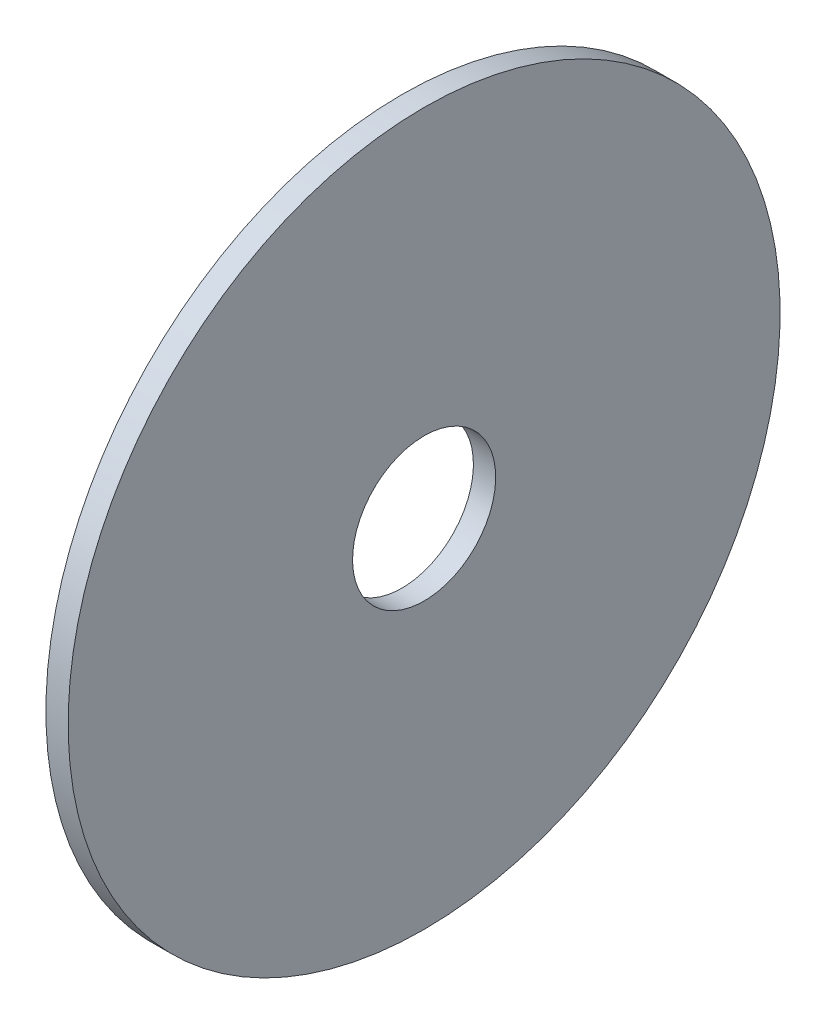
ISO-10303-21;
HEADER;
FILE_DESCRIPTION(('STEP AP214'),'2;1');
FILE_NAME('part.step','',(''),(''),'','','');
FILE_SCHEMA(('AUTOMOTIVE_DESIGN { 1 0 10303 214 1 1 1 1 }'));
ENDSEC;
DATA;
#1=APPLICATION_CONTEXT('core data for automotive mechanical design processes');
#2=APPLICATION_PROTOCOL_DEFINITION('international standard','automotive_design',2000,#1);
#3=PRODUCT_CONTEXT('',#1,'mechanical');
#4=PRODUCT('Part','Part','',(#3));
#5=PRODUCT_RELATED_PRODUCT_CATEGORY('part','',(#4));
#6=PRODUCT_DEFINITION_FORMATION('','',#4);
#7=PRODUCT_DEFINITION_CONTEXT('part definition',#1,'design');
#8=PRODUCT_DEFINITION('design','',#6,#7);
#9=PRODUCT_DEFINITION_SHAPE('','',#8);
#10=(LENGTH_UNIT() NAMED_UNIT(*) SI_UNIT(.MILLI.,.METRE.));
#11=(NAMED_UNIT(*) PLANE_ANGLE_UNIT() SI_UNIT($,.RADIAN.));
#12=(NAMED_UNIT(*) SI_UNIT($,.STERADIAN.) SOLID_ANGLE_UNIT());
#13=UNCERTAINTY_MEASURE_WITH_UNIT(LENGTH_MEASURE(1.E-05),#10,'distance_accuracy_value','');
#14=(GEOMETRIC_REPRESENTATION_CONTEXT(3) GLOBAL_UNCERTAINTY_ASSIGNED_CONTEXT((#13)) GLOBAL_UNIT_ASSIGNED_CONTEXT((#10,
#11,#12)) REPRESENTATION_CONTEXT('',''));
#15=CARTESIAN_POINT('',(0.,0.,0.));
#16=DIRECTION('',(0.,0.,1.));
#17=DIRECTION('',(1.,0.,0.));
#18=AXIS2_PLACEMENT_3D('',#15,#16,#17);
#19=CARTESIAN_POINT('',(350.04375,-142.016295077605,374.65));
#20=DIRECTION('',(-1.,0.,0.));
#21=DIRECTION('',(0.,-1.,0.));
#22=AXIS2_PLACEMENT_3D('',#19,#20,#21);
#23=CYLINDRICAL_SURFACE('',#22,12.7);
#24=CARTESIAN_POINT('',(350.04375,-142.016295077605,374.65));
#25=DIRECTION('',(1.,0.,0.));
#26=DIRECTION('',(0.,1.,0.));
#27=AXIS2_PLACEMENT_3D('',#24,#25,#26);
#28=CIRCLE('',#27,12.7);
#29=CARTESIAN_POINT('',(350.04375,-129.316295077605,374.65));
#30=VERTEX_POINT('',#29);
#31=EDGE_CURVE('E23',#30,#30,#28,.T.);
#32=ORIENTED_EDGE('',*,*,#31,.F.);
#33=EDGE_LOOP('',(#32));
#34=FACE_BOUND('',#33,.T.);
#35=CARTESIAN_POINT('',(349.25,-142.016295077605,374.65));
#36=DIRECTION('',(1.,0.,0.));
#37=DIRECTION('',(0.,1.,0.));
#38=AXIS2_PLACEMENT_3D('',#35,#36,#37);
#39=CIRCLE('',#38,12.7);
#40=CARTESIAN_POINT('',(349.25,-129.316295077605,374.65));
#41=VERTEX_POINT('',#40);
#42=EDGE_CURVE('E32',#41,#41,#39,.T.);
#43=ORIENTED_EDGE('',*,*,#42,.T.);
#44=EDGE_LOOP('',(#43));
#45=FACE_BOUND('',#44,.T.);
#46=ADVANCED_FACE('F15',(#34,#45),#23,.T.);
#47=CARTESIAN_POINT('',(350.04375,-142.016295077605,374.65));
#48=DIRECTION('',(-1.,0.,0.));
#49=DIRECTION('',(0.,-1.,0.));
#50=AXIS2_PLACEMENT_3D('',#47,#48,#49);
#51=CYLINDRICAL_SURFACE('',#50,2.5527);
#52=CARTESIAN_POINT('',(350.04375,-142.016295077605,374.65));
#53=DIRECTION('',(1.,0.,0.));
#54=DIRECTION('',(0.,1.,0.));
#55=AXIS2_PLACEMENT_3D('',#52,#53,#54);
#56=CIRCLE('',#55,2.5527);
#57=CARTESIAN_POINT('',(350.04375,-139.463595077605,374.65));
#58=VERTEX_POINT('',#57);
#59=EDGE_CURVE('E10',#58,#58,#56,.T.);
#60=ORIENTED_EDGE('',*,*,#59,.T.);
#61=EDGE_LOOP('',(#60));
#62=FACE_BOUND('',#61,.T.);
#63=CARTESIAN_POINT('',(349.25,-142.016295077605,374.65));
#64=DIRECTION('',(1.,0.,0.));
#65=DIRECTION('',(0.,1.,0.));
#66=AXIS2_PLACEMENT_3D('',#63,#64,#65);
#67=CIRCLE('',#66,2.5527);
#68=CARTESIAN_POINT('',(349.25,-139.463595077605,374.65));
#69=VERTEX_POINT('',#68);
#70=EDGE_CURVE('E18',#69,#69,#67,.T.);
#71=ORIENTED_EDGE('',*,*,#70,.F.);
#72=EDGE_LOOP('',(#71));
#73=FACE_BOUND('',#72,.T.);
#74=ADVANCED_FACE('F42',(#62,#73),#51,.F.);
#75=CARTESIAN_POINT('',(350.04375,-142.016295077605,374.65));
#76=DIRECTION('',(1.,0.,0.));
#77=DIRECTION('',(0.,1.,0.));
#78=AXIS2_PLACEMENT_3D('',#75,#76,#77);
#79=PLANE('',#78);
#80=ORIENTED_EDGE('',*,*,#31,.T.);
#81=EDGE_LOOP('',(#80));
#82=FACE_BOUND('',#81,.T.);
#83=ORIENTED_EDGE('',*,*,#59,.F.);
#84=EDGE_LOOP('',(#83));
#85=FACE_BOUND('',#84,.T.);
#86=ADVANCED_FACE('F44',(#82,#85),#79,.T.);
#87=CARTESIAN_POINT('',(349.25,-142.016295077605,374.65));
#88=DIRECTION('',(1.,0.,0.));
#89=DIRECTION('',(0.,1.,0.));
#90=AXIS2_PLACEMENT_3D('',#87,#88,#89);
#91=PLANE('',#90);
#92=ORIENTED_EDGE('',*,*,#42,.F.);
#93=EDGE_LOOP('',(#92));
#94=FACE_BOUND('',#93,.T.);
#95=ORIENTED_EDGE('',*,*,#70,.T.);
#96=EDGE_LOOP('',(#95));
#97=FACE_BOUND('',#96,.T.);
#98=ADVANCED_FACE('F40',(#94,#97),#91,.F.);
#99=CLOSED_SHELL('',(#46,#74,#86,#98));
#100=MANIFOLD_SOLID_BREP('B1',#99);
#101=ADVANCED_BREP_SHAPE_REPRESENTATION('',(#18,#100),#14);
#102=SHAPE_DEFINITION_REPRESENTATION(#9,#101);
ENDSEC;
END-ISO-10303-21;
